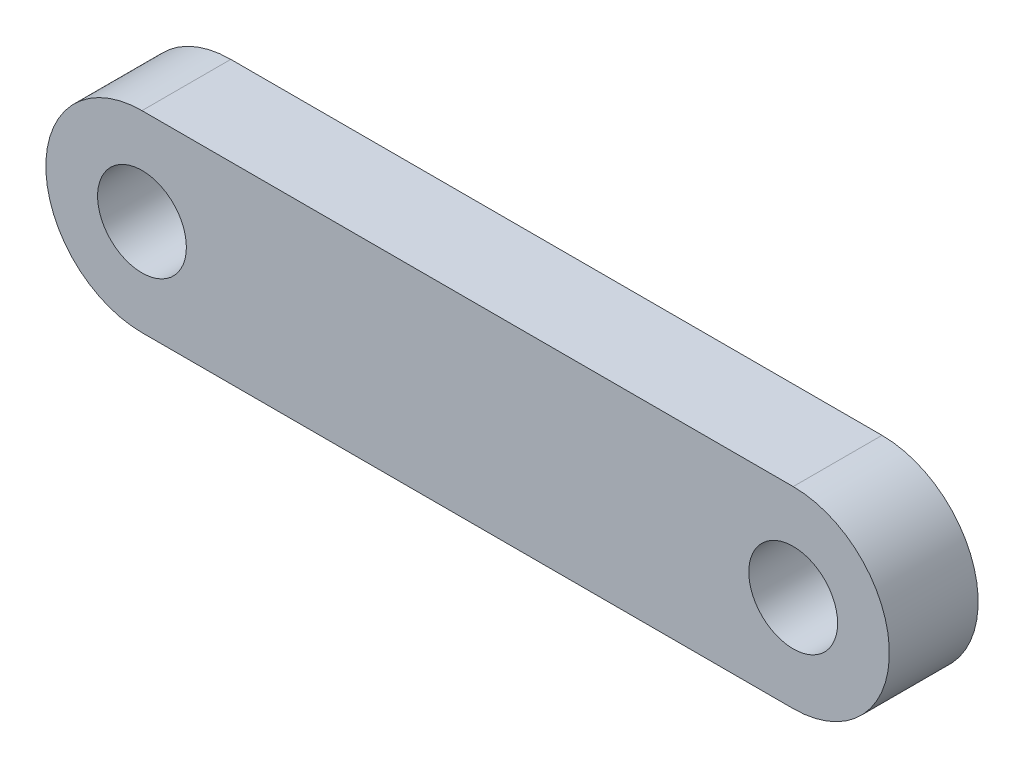
ISO-10303-21;
HEADER;
FILE_DESCRIPTION(('STEP AP214'),'2;1');
FILE_NAME('part.step','',(''),(''),'','','');
FILE_SCHEMA(('AUTOMOTIVE_DESIGN { 1 0 10303 214 1 1 1 1 }'));
ENDSEC;
DATA;
#1=APPLICATION_CONTEXT('core data for automotive mechanical design processes');
#2=APPLICATION_PROTOCOL_DEFINITION('international standard','automotive_design',2000,#1);
#3=PRODUCT_CONTEXT('',#1,'mechanical');
#4=PRODUCT('Part','Part','',(#3));
#5=PRODUCT_RELATED_PRODUCT_CATEGORY('part','',(#4));
#6=PRODUCT_DEFINITION_FORMATION('','',#4);
#7=PRODUCT_DEFINITION_CONTEXT('part definition',#1,'design');
#8=PRODUCT_DEFINITION('design','',#6,#7);
#9=PRODUCT_DEFINITION_SHAPE('','',#8);
#10=(LENGTH_UNIT() NAMED_UNIT(*) SI_UNIT(.MILLI.,.METRE.));
#11=(NAMED_UNIT(*) PLANE_ANGLE_UNIT() SI_UNIT($,.RADIAN.));
#12=(NAMED_UNIT(*) SI_UNIT($,.STERADIAN.) SOLID_ANGLE_UNIT());
#13=UNCERTAINTY_MEASURE_WITH_UNIT(LENGTH_MEASURE(1.E-05),#10,'distance_accuracy_value','');
#14=(GEOMETRIC_REPRESENTATION_CONTEXT(3) GLOBAL_UNCERTAINTY_ASSIGNED_CONTEXT((#13)) GLOBAL_UNIT_ASSIGNED_CONTEXT((#10,
#11,#12)) REPRESENTATION_CONTEXT('',''));
#15=CARTESIAN_POINT('',(0.,0.,0.));
#16=DIRECTION('',(0.,0.,1.));
#17=DIRECTION('',(1.,0.,0.));
#18=AXIS2_PLACEMENT_3D('',#15,#16,#17);
#19=CARTESIAN_POINT('',(221.299270364465,133.736291717673,3.));
#20=DIRECTION('',(0.,0.,1.));
#21=DIRECTION('',(1.,0.,0.));
#22=AXIS2_PLACEMENT_3D('',#19,#20,#21);
#23=PLANE('',#22);
#24=CARTESIAN_POINT('',(199.29931162483,133.735744618646,3.));
#25=DIRECTION('',(0.,0.,1.));
#26=DIRECTION('',(1.,0.,0.));
#27=AXIS2_PLACEMENT_3D('',#24,#25,#26);
#28=CIRCLE('',#27,1.5);
#29=CARTESIAN_POINT('',(200.79931162483,133.735744618646,3.));
#30=VERTEX_POINT('',#29);
#31=EDGE_CURVE('E100',#30,#30,#28,.T.);
#32=ORIENTED_EDGE('',*,*,#31,.F.);
#33=EDGE_LOOP('',(#32));
#34=FACE_BOUND('',#33,.T.);
#35=CARTESIAN_POINT('',(221.299270364465,133.736291717673,3.));
#36=DIRECTION('',(0.,0.,1.));
#37=DIRECTION('',(1.,0.,0.));
#38=AXIS2_PLACEMENT_3D('',#35,#36,#37);
#39=CIRCLE('',#38,3.24832479038684);
#40=CARTESIAN_POINT('',(221.29931162483,130.487966927548,3.));
#41=VERTEX_POINT('',#40);
#42=CARTESIAN_POINT('',(221.29931162483,136.984616507798,3.));
#43=VERTEX_POINT('',#42);
#44=EDGE_CURVE('E85',#41,#43,#39,.T.);
#45=ORIENTED_EDGE('',*,*,#44,.T.);
#46=DIRECTION('',(-0.999999998763151,-4.97362751062837E-05,0.));
#47=VECTOR('',#46,1.);
#48=CARTESIAN_POINT('',(221.29931162483,136.984616507798,3.));
#49=LINE('',#48,#47);
#50=CARTESIAN_POINT('',(199.29931162483,136.983522309744,3.));
#51=VERTEX_POINT('',#50);
#52=EDGE_CURVE('E80',#43,#51,#49,.T.);
#53=ORIENTED_EDGE('',*,*,#52,.T.);
#54=CARTESIAN_POINT('',(199.29931162483,133.735744618646,3.));
#55=DIRECTION('',(0.,0.,1.));
#56=DIRECTION('',(1.,0.,0.));
#57=AXIS2_PLACEMENT_3D('',#54,#55,#56);
#58=CIRCLE('',#57,3.24777769109805);
#59=CARTESIAN_POINT('',(199.29931162483,130.487966927548,3.));
#60=VERTEX_POINT('',#59);
#61=EDGE_CURVE('E83',#51,#60,#58,.T.);
#62=ORIENTED_EDGE('',*,*,#61,.T.);
#63=DIRECTION('',(1.,0.,0.));
#64=VECTOR('',#63,1.);
#65=CARTESIAN_POINT('',(221.29931162483,130.487966927548,3.));
#66=LINE('',#65,#64);
#67=EDGE_CURVE('E50',#60,#41,#66,.T.);
#68=ORIENTED_EDGE('',*,*,#67,.T.);
#69=EDGE_LOOP('',(#45,#53,#62,#68));
#70=FACE_BOUND('',#69,.T.);
#71=CARTESIAN_POINT('',(221.29931162483,133.735744618646,3.));
#72=DIRECTION('',(0.,0.,1.));
#73=DIRECTION('',(1.,0.,0.));
#74=AXIS2_PLACEMENT_3D('',#71,#72,#73);
#75=CIRCLE('',#74,1.5);
#76=CARTESIAN_POINT('',(222.79931162483,133.735744618646,3.));
#77=VERTEX_POINT('',#76);
#78=EDGE_CURVE('E115',#77,#77,#75,.T.);
#79=ORIENTED_EDGE('',*,*,#78,.F.);
#80=EDGE_LOOP('',(#79));
#81=FACE_BOUND('',#80,.T.);
#82=ADVANCED_FACE('F33',(#34,#70,#81),#23,.T.);
#83=CARTESIAN_POINT('',(221.299270364465,133.736291717673,0.));
#84=DIRECTION('',(0.,0.,1.));
#85=DIRECTION('',(1.,0.,0.));
#86=AXIS2_PLACEMENT_3D('',#83,#84,#85);
#87=PLANE('',#86);
#88=CARTESIAN_POINT('',(221.299270364465,133.736291717673,0.));
#89=DIRECTION('',(0.,0.,1.));
#90=DIRECTION('',(1.,0.,0.));
#91=AXIS2_PLACEMENT_3D('',#88,#89,#90);
#92=CIRCLE('',#91,3.24832479038684);
#93=CARTESIAN_POINT('',(221.29931162483,130.487966927548,0.));
#94=VERTEX_POINT('',#93);
#95=CARTESIAN_POINT('',(221.29931162483,136.984616507798,0.));
#96=VERTEX_POINT('',#95);
#97=EDGE_CURVE('E97',#94,#96,#92,.T.);
#98=ORIENTED_EDGE('',*,*,#97,.F.);
#99=DIRECTION('',(1.,0.,0.));
#100=VECTOR('',#99,1.);
#101=CARTESIAN_POINT('',(221.29931162483,130.487966927548,0.));
#102=LINE('',#101,#100);
#103=CARTESIAN_POINT('',(199.29931162483,130.487966927548,0.));
#104=VERTEX_POINT('',#103);
#105=EDGE_CURVE('E73',#104,#94,#102,.T.);
#106=ORIENTED_EDGE('',*,*,#105,.F.);
#107=CARTESIAN_POINT('',(199.29931162483,133.735744618646,0.));
#108=DIRECTION('',(0.,0.,1.));
#109=DIRECTION('',(1.,0.,0.));
#110=AXIS2_PLACEMENT_3D('',#107,#108,#109);
#111=CIRCLE('',#110,3.24777769109805);
#112=CARTESIAN_POINT('',(199.29931162483,136.983522309744,0.));
#113=VERTEX_POINT('',#112);
#114=EDGE_CURVE('E67',#113,#104,#111,.T.);
#115=ORIENTED_EDGE('',*,*,#114,.F.);
#116=DIRECTION('',(-0.999999998763151,-4.97362751062837E-05,0.));
#117=VECTOR('',#116,1.);
#118=CARTESIAN_POINT('',(221.29931162483,136.984616507798,0.));
#119=LINE('',#118,#117);
#120=EDGE_CURVE('E89',#96,#113,#119,.T.);
#121=ORIENTED_EDGE('',*,*,#120,.F.);
#122=EDGE_LOOP('',(#98,#106,#115,#121));
#123=FACE_BOUND('',#122,.T.);
#124=CARTESIAN_POINT('',(199.29931162483,133.735744618646,0.));
#125=DIRECTION('',(0.,0.,1.));
#126=DIRECTION('',(1.,0.,0.));
#127=AXIS2_PLACEMENT_3D('',#124,#125,#126);
#128=CIRCLE('',#127,1.5);
#129=CARTESIAN_POINT('',(200.79931162483,133.735744618646,0.));
#130=VERTEX_POINT('',#129);
#131=EDGE_CURVE('E112',#130,#130,#128,.T.);
#132=ORIENTED_EDGE('',*,*,#131,.T.);
#133=EDGE_LOOP('',(#132));
#134=FACE_BOUND('',#133,.T.);
#135=CARTESIAN_POINT('',(221.29931162483,133.735744618646,0.));
#136=DIRECTION('',(0.,0.,1.));
#137=DIRECTION('',(1.,0.,0.));
#138=AXIS2_PLACEMENT_3D('',#135,#136,#137);
#139=CIRCLE('',#138,1.5);
#140=CARTESIAN_POINT('',(222.79931162483,133.735744618646,0.));
#141=VERTEX_POINT('',#140);
#142=EDGE_CURVE('E118',#141,#141,#139,.T.);
#143=ORIENTED_EDGE('',*,*,#142,.T.);
#144=EDGE_LOOP('',(#143));
#145=FACE_BOUND('',#144,.T.);
#146=ADVANCED_FACE('F108',(#123,#134,#145),#87,.F.);
#147=CARTESIAN_POINT('',(221.299270364465,133.736291717673,3.));
#148=DIRECTION('',(0.,0.,-1.));
#149=DIRECTION('',(-1.,0.,0.));
#150=AXIS2_PLACEMENT_3D('',#147,#148,#149);
#151=CYLINDRICAL_SURFACE('',#150,3.24832479038684);
#152=ORIENTED_EDGE('',*,*,#97,.T.);
#153=DIRECTION('',(0.,0.,-1.));
#154=VECTOR('',#153,1.);
#155=CARTESIAN_POINT('',(221.29931162483,136.984616507798,3.));
#156=LINE('',#155,#154);
#157=EDGE_CURVE('E11',#43,#96,#156,.T.);
#158=ORIENTED_EDGE('',*,*,#157,.F.);
#159=ORIENTED_EDGE('',*,*,#44,.F.);
#160=DIRECTION('',(0.,0.,-1.));
#161=VECTOR('',#160,1.);
#162=CARTESIAN_POINT('',(221.29931162483,130.487966927548,3.));
#163=LINE('',#162,#161);
#164=EDGE_CURVE('E93',#41,#94,#163,.T.);
#165=ORIENTED_EDGE('',*,*,#164,.T.);
#166=EDGE_LOOP('',(#152,#158,#159,#165));
#167=FACE_BOUND('',#166,.T.);
#168=ADVANCED_FACE('F35',(#167),#151,.T.);
#169=CARTESIAN_POINT('',(221.29931162483,136.984616507798,3.));
#170=DIRECTION('',(4.97362751062837E-05,-0.999999998763152,0.));
#171=DIRECTION('',(0.999999998763152,4.97362751062837E-05,0.));
#172=AXIS2_PLACEMENT_3D('',#169,#170,#171);
#173=PLANE('',#172);
#174=ORIENTED_EDGE('',*,*,#120,.T.);
#175=DIRECTION('',(0.,0.,-1.));
#176=VECTOR('',#175,1.);
#177=CARTESIAN_POINT('',(199.29931162483,136.983522309744,3.));
#178=LINE('',#177,#176);
#179=EDGE_CURVE('E42',#51,#113,#178,.T.);
#180=ORIENTED_EDGE('',*,*,#179,.F.);
#181=ORIENTED_EDGE('',*,*,#52,.F.);
#182=ORIENTED_EDGE('',*,*,#157,.T.);
#183=EDGE_LOOP('',(#174,#180,#181,#182));
#184=FACE_BOUND('',#183,.T.);
#185=ADVANCED_FACE('F88',(#184),#173,.F.);
#186=CARTESIAN_POINT('',(199.29931162483,133.735744618646,3.));
#187=DIRECTION('',(0.,0.,-1.));
#188=DIRECTION('',(-1.,0.,0.));
#189=AXIS2_PLACEMENT_3D('',#186,#187,#188);
#190=CYLINDRICAL_SURFACE('',#189,3.24777769109805);
#191=ORIENTED_EDGE('',*,*,#114,.T.);
#192=DIRECTION('',(0.,0.,-1.));
#193=VECTOR('',#192,1.);
#194=CARTESIAN_POINT('',(199.29931162483,130.487966927548,3.));
#195=LINE('',#194,#193);
#196=EDGE_CURVE('E90',#60,#104,#195,.T.);
#197=ORIENTED_EDGE('',*,*,#196,.F.);
#198=ORIENTED_EDGE('',*,*,#61,.F.);
#199=ORIENTED_EDGE('',*,*,#179,.T.);
#200=EDGE_LOOP('',(#191,#197,#198,#199));
#201=FACE_BOUND('',#200,.T.);
#202=ADVANCED_FACE('F91',(#201),#190,.T.);
#203=CARTESIAN_POINT('',(221.29931162483,130.487966927548,3.));
#204=DIRECTION('',(0.,1.,0.));
#205=DIRECTION('',(-1.,0.,0.));
#206=AXIS2_PLACEMENT_3D('',#203,#204,#205);
#207=PLANE('',#206);
#208=ORIENTED_EDGE('',*,*,#105,.T.);
#209=ORIENTED_EDGE('',*,*,#164,.F.);
#210=ORIENTED_EDGE('',*,*,#67,.F.);
#211=ORIENTED_EDGE('',*,*,#196,.T.);
#212=EDGE_LOOP('',(#208,#209,#210,#211));
#213=FACE_BOUND('',#212,.T.);
#214=ADVANCED_FACE('F105',(#213),#207,.F.);
#215=CARTESIAN_POINT('',(199.29931162483,133.735744618646,3.));
#216=DIRECTION('',(0.,0.,-1.));
#217=DIRECTION('',(-1.,0.,0.));
#218=AXIS2_PLACEMENT_3D('',#215,#216,#217);
#219=CYLINDRICAL_SURFACE('',#218,1.5);
#220=ORIENTED_EDGE('',*,*,#31,.T.);
#221=EDGE_LOOP('',(#220));
#222=FACE_BOUND('',#221,.T.);
#223=ORIENTED_EDGE('',*,*,#131,.F.);
#224=EDGE_LOOP('',(#223));
#225=FACE_BOUND('',#224,.T.);
#226=ADVANCED_FACE('F135',(#222,#225),#219,.F.);
#227=CARTESIAN_POINT('',(221.29931162483,133.735744618646,3.));
#228=DIRECTION('',(0.,0.,-1.));
#229=DIRECTION('',(-1.,0.,0.));
#230=AXIS2_PLACEMENT_3D('',#227,#228,#229);
#231=CYLINDRICAL_SURFACE('',#230,1.5);
#232=ORIENTED_EDGE('',*,*,#78,.T.);
#233=EDGE_LOOP('',(#232));
#234=FACE_BOUND('',#233,.T.);
#235=ORIENTED_EDGE('',*,*,#142,.F.);
#236=EDGE_LOOP('',(#235));
#237=FACE_BOUND('',#236,.T.);
#238=ADVANCED_FACE('F124',(#234,#237),#231,.F.);
#239=CLOSED_SHELL('',(#82,#146,#168,#185,#202,#214,#226,#238));
#240=MANIFOLD_SOLID_BREP('B2',#239);
#241=ADVANCED_BREP_SHAPE_REPRESENTATION('',(#18,#240),#14);
#242=SHAPE_DEFINITION_REPRESENTATION(#9,#241);
ENDSEC;
END-ISO-10303-21;
